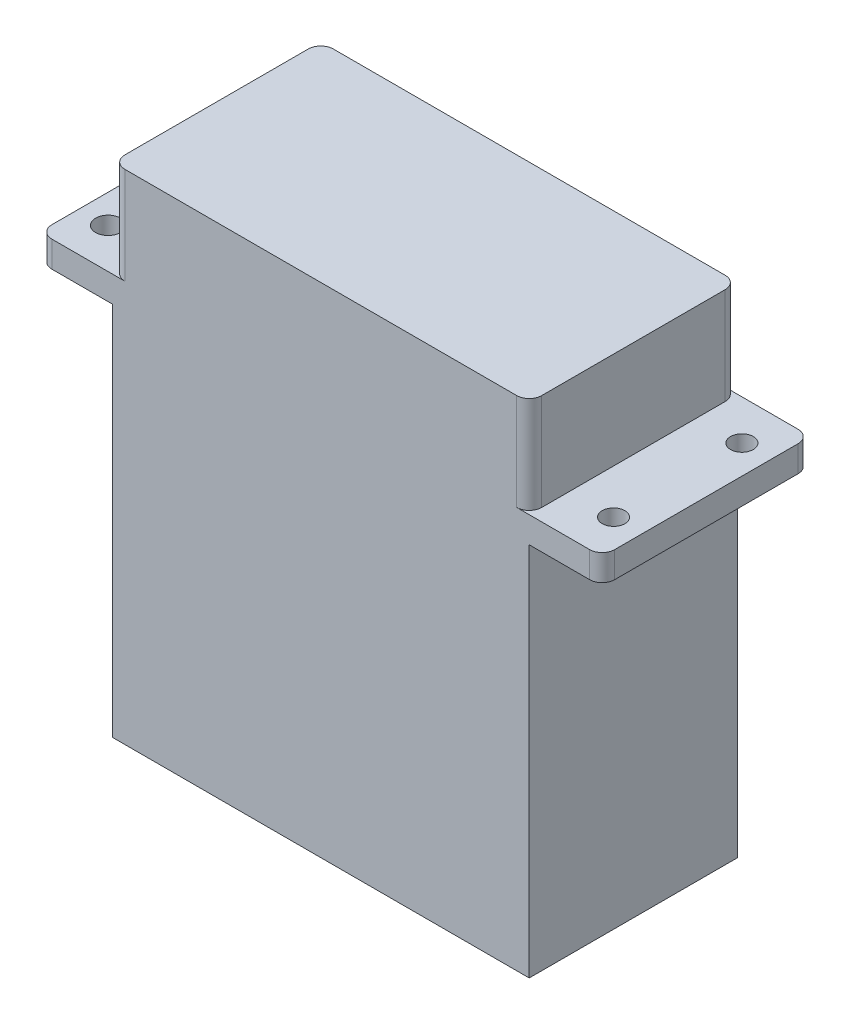
ISO-10303-21;
HEADER;
FILE_DESCRIPTION(('STEP AP214'),'2;1');
FILE_NAME('part.step','',(''),(''),'','','');
FILE_SCHEMA(('AUTOMOTIVE_DESIGN { 1 0 10303 214 1 1 1 1 }'));
ENDSEC;
DATA;
#1=APPLICATION_CONTEXT('core data for automotive mechanical design processes');
#2=APPLICATION_PROTOCOL_DEFINITION('international standard','automotive_design',2000,#1);
#3=PRODUCT_CONTEXT('',#1,'mechanical');
#4=PRODUCT('Part','Part','',(#3));
#5=PRODUCT_RELATED_PRODUCT_CATEGORY('part','',(#4));
#6=PRODUCT_DEFINITION_FORMATION('','',#4);
#7=PRODUCT_DEFINITION_CONTEXT('part definition',#1,'design');
#8=PRODUCT_DEFINITION('design','',#6,#7);
#9=PRODUCT_DEFINITION_SHAPE('','',#8);
#10=(LENGTH_UNIT() NAMED_UNIT(*) SI_UNIT(.MILLI.,.METRE.));
#11=(NAMED_UNIT(*) PLANE_ANGLE_UNIT() SI_UNIT($,.RADIAN.));
#12=(NAMED_UNIT(*) SI_UNIT($,.STERADIAN.) SOLID_ANGLE_UNIT());
#13=UNCERTAINTY_MEASURE_WITH_UNIT(LENGTH_MEASURE(1.E-05),#10,'distance_accuracy_value','');
#14=(GEOMETRIC_REPRESENTATION_CONTEXT(3) GLOBAL_UNCERTAINTY_ASSIGNED_CONTEXT((#13)) GLOBAL_UNIT_ASSIGNED_CONTEXT((#10,
#11,#12)) REPRESENTATION_CONTEXT('',''));
#15=CARTESIAN_POINT('',(0.,0.,0.));
#16=DIRECTION('',(0.,0.,1.));
#17=DIRECTION('',(1.,0.,0.));
#18=AXIS2_PLACEMENT_3D('',#15,#16,#17);
#19=CARTESIAN_POINT('',(52.8,0.,-1.2));
#20=DIRECTION('',(0.,1.,0.));
#21=DIRECTION('',(0.,0.,1.));
#22=AXIS2_PLACEMENT_3D('',#19,#20,#21);
#23=PLANE('',#22);
#24=CARTESIAN_POINT('',(2.75,0.,-3.84098530833331));
#25=DIRECTION('',(0.,1.,0.));
#26=DIRECTION('',(0.,0.,-1.));
#27=AXIS2_PLACEMENT_3D('',#24,#25,#26);
#28=CIRCLE('',#27,1.20002723055091);
#29=CARTESIAN_POINT('',(2.75,0.,-5.04101253888422));
#30=VERTEX_POINT('',#29);
#31=EDGE_CURVE('E263',#30,#30,#28,.T.);
#32=ORIENTED_EDGE('',*,*,#31,.T.);
#33=EDGE_LOOP('',(#32));
#34=FACE_BOUND('',#33,.T.);
#35=CARTESIAN_POINT('',(2.75,0.,-16.1590146916667));
#36=DIRECTION('',(0.,1.,0.));
#37=DIRECTION('',(0.,0.,1.));
#38=AXIS2_PLACEMENT_3D('',#35,#36,#37);
#39=CIRCLE('',#38,1.20002723055091);
#40=CARTESIAN_POINT('',(2.75,0.,-14.9589874611158));
#41=VERTEX_POINT('',#40);
#42=EDGE_CURVE('E279',#41,#41,#39,.T.);
#43=ORIENTED_EDGE('',*,*,#42,.T.);
#44=EDGE_LOOP('',(#43));
#45=FACE_BOUND('',#44,.T.);
#46=DIRECTION('',(0.,0.,-1.));
#47=VECTOR('',#46,1.);
#48=CARTESIAN_POINT('',(7.,0.,0.));
#49=LINE('',#48,#47);
#50=CARTESIAN_POINT('',(7.,0.,0.));
#51=VERTEX_POINT('',#50);
#52=CARTESIAN_POINT('',(7.,0.,-20.));
#53=VERTEX_POINT('',#52);
#54=EDGE_CURVE('E198',#51,#53,#49,.T.);
#55=ORIENTED_EDGE('',*,*,#54,.F.);
#56=DIRECTION('',(1.,0.,0.));
#57=VECTOR('',#56,1.);
#58=CARTESIAN_POINT('',(1.20000000000001,0.,0.));
#59=LINE('',#58,#57);
#60=CARTESIAN_POINT('',(1.20000000000001,0.,0.));
#61=VERTEX_POINT('',#60);
#62=EDGE_CURVE('E292',#61,#51,#59,.T.);
#63=ORIENTED_EDGE('',*,*,#62,.F.);
#64=CARTESIAN_POINT('',(1.2,0.,-1.2));
#65=DIRECTION('',(0.,1.,0.));
#66=DIRECTION('',(0.,0.,-1.));
#67=AXIS2_PLACEMENT_3D('',#64,#65,#66);
#68=CIRCLE('',#67,1.2);
#69=CARTESIAN_POINT('',(0.,0.,-1.20000000000001));
#70=VERTEX_POINT('',#69);
#71=EDGE_CURVE('E321',#70,#61,#68,.T.);
#72=ORIENTED_EDGE('',*,*,#71,.F.);
#73=DIRECTION('',(0.,0.,1.));
#74=VECTOR('',#73,1.);
#75=CARTESIAN_POINT('',(0.,0.,-1.20000000000001));
#76=LINE('',#75,#74);
#77=CARTESIAN_POINT('',(0.,0.,-18.8));
#78=VERTEX_POINT('',#77);
#79=EDGE_CURVE('E319',#78,#70,#76,.T.);
#80=ORIENTED_EDGE('',*,*,#79,.F.);
#81=CARTESIAN_POINT('',(1.2,0.,-18.8));
#82=DIRECTION('',(0.,1.,0.));
#83=DIRECTION('',(0.,0.,-1.));
#84=AXIS2_PLACEMENT_3D('',#81,#82,#83);
#85=CIRCLE('',#84,1.2);
#86=CARTESIAN_POINT('',(1.2,0.,-20.));
#87=VERTEX_POINT('',#86);
#88=EDGE_CURVE('E317',#87,#78,#85,.T.);
#89=ORIENTED_EDGE('',*,*,#88,.F.);
#90=DIRECTION('',(-1.,0.,0.));
#91=VECTOR('',#90,1.);
#92=CARTESIAN_POINT('',(1.20000000000001,0.,-20.));
#93=LINE('',#92,#91);
#94=EDGE_CURVE('E54',#53,#87,#93,.T.);
#95=ORIENTED_EDGE('',*,*,#94,.F.);
#96=EDGE_LOOP('',(#55,#63,#72,#80,#89,#95));
#97=FACE_BOUND('',#96,.T.);
#98=ADVANCED_FACE('F39',(#34,#45,#97),#23,.F.);
#99=CARTESIAN_POINT('',(51.25,0.,-3.84098530833331));
#100=DIRECTION('',(0.,1.,0.));
#101=DIRECTION('',(0.,0.,-1.));
#102=AXIS2_PLACEMENT_3D('',#99,#100,#101);
#103=CIRCLE('',#102,1.08768401807164);
#104=CARTESIAN_POINT('',(51.25,0.,-4.92866932640495));
#105=VERTEX_POINT('',#104);
#106=EDGE_CURVE('E267',#105,#105,#103,.T.);
#107=ORIENTED_EDGE('',*,*,#106,.T.);
#108=EDGE_LOOP('',(#107));
#109=FACE_BOUND('',#108,.T.);
#110=CARTESIAN_POINT('',(51.25,0.,-16.1590146916667));
#111=DIRECTION('',(0.,1.,0.));
#112=DIRECTION('',(0.,0.,1.));
#113=AXIS2_PLACEMENT_3D('',#110,#111,#112);
#114=CIRCLE('',#113,1.08768401807164);
#115=CARTESIAN_POINT('',(51.25,0.,-15.071330673595));
#116=VERTEX_POINT('',#115);
#117=EDGE_CURVE('E273',#116,#116,#114,.T.);
#118=ORIENTED_EDGE('',*,*,#117,.T.);
#119=EDGE_LOOP('',(#118));
#120=FACE_BOUND('',#119,.T.);
#121=DIRECTION('',(0.,0.,1.));
#122=VECTOR('',#121,1.);
#123=CARTESIAN_POINT('',(47.,0.,0.));
#124=LINE('',#123,#122);
#125=CARTESIAN_POINT('',(47.,0.,-20.));
#126=VERTEX_POINT('',#125);
#127=CARTESIAN_POINT('',(47.,0.,0.));
#128=VERTEX_POINT('',#127);
#129=EDGE_CURVE('E62',#126,#128,#124,.T.);
#130=ORIENTED_EDGE('',*,*,#129,.F.);
#131=CARTESIAN_POINT('',(52.8,0.,-20.));
#132=VERTEX_POINT('',#131);
#133=EDGE_CURVE('E315',#132,#126,#93,.T.);
#134=ORIENTED_EDGE('',*,*,#133,.F.);
#135=CARTESIAN_POINT('',(52.8,0.,-18.8));
#136=DIRECTION('',(0.,1.,0.));
#137=DIRECTION('',(0.,0.,-1.));
#138=AXIS2_PLACEMENT_3D('',#135,#136,#137);
#139=CIRCLE('',#138,1.2);
#140=CARTESIAN_POINT('',(54.,0.,-18.8));
#141=VERTEX_POINT('',#140);
#142=EDGE_CURVE('E313',#141,#132,#139,.T.);
#143=ORIENTED_EDGE('',*,*,#142,.F.);
#144=DIRECTION('',(0.,0.,-1.));
#145=VECTOR('',#144,1.);
#146=CARTESIAN_POINT('',(54.,0.,-1.20000000000001));
#147=LINE('',#146,#145);
#148=CARTESIAN_POINT('',(54.,0.,-1.20000000000001));
#149=VERTEX_POINT('',#148);
#150=EDGE_CURVE('E311',#149,#141,#147,.T.);
#151=ORIENTED_EDGE('',*,*,#150,.F.);
#152=CARTESIAN_POINT('',(52.8,0.,-1.2));
#153=DIRECTION('',(0.,1.,0.));
#154=DIRECTION('',(0.,0.,1.));
#155=AXIS2_PLACEMENT_3D('',#152,#153,#154);
#156=CIRCLE('',#155,1.2);
#157=CARTESIAN_POINT('',(52.8,0.,0.));
#158=VERTEX_POINT('',#157);
#159=EDGE_CURVE('E285',#158,#149,#156,.T.);
#160=ORIENTED_EDGE('',*,*,#159,.F.);
#161=EDGE_CURVE('E323',#128,#158,#59,.T.);
#162=ORIENTED_EDGE('',*,*,#161,.F.);
#163=EDGE_LOOP('',(#130,#134,#143,#151,#160,#162));
#164=FACE_BOUND('',#163,.T.);
#165=ADVANCED_FACE('F350',(#109,#120,#164),#23,.F.);
#166=CARTESIAN_POINT('',(52.8,2.5,-1.2));
#167=DIRECTION('',(0.,1.,0.));
#168=DIRECTION('',(0.,0.,1.));
#169=AXIS2_PLACEMENT_3D('',#166,#167,#168);
#170=PLANE('',#169);
#171=CARTESIAN_POINT('',(45.8,2.5,-18.8));
#172=DIRECTION('',(0.,1.,0.));
#173=DIRECTION('',(0.,0.,-1.));
#174=AXIS2_PLACEMENT_3D('',#171,#172,#173);
#175=CIRCLE('',#174,1.2);
#176=CARTESIAN_POINT('',(47.,2.5,-18.8));
#177=VERTEX_POINT('',#176);
#178=CARTESIAN_POINT('',(45.8,2.5,-20.));
#179=VERTEX_POINT('',#178);
#180=EDGE_CURVE('E212',#177,#179,#175,.T.);
#181=ORIENTED_EDGE('',*,*,#180,.F.);
#182=DIRECTION('',(0.,0.,-1.));
#183=VECTOR('',#182,1.);
#184=CARTESIAN_POINT('',(47.,2.5,-18.8));
#185=LINE('',#184,#183);
#186=CARTESIAN_POINT('',(47.,2.5,-1.20000000000001));
#187=VERTEX_POINT('',#186);
#188=EDGE_CURVE('E235',#187,#177,#185,.T.);
#189=ORIENTED_EDGE('',*,*,#188,.F.);
#190=CARTESIAN_POINT('',(45.8,2.5,-1.2));
#191=DIRECTION('',(0.,1.,0.));
#192=DIRECTION('',(0.,0.,1.));
#193=AXIS2_PLACEMENT_3D('',#190,#191,#192);
#194=CIRCLE('',#193,1.2);
#195=CARTESIAN_POINT('',(45.8,2.5,0.));
#196=VERTEX_POINT('',#195);
#197=EDGE_CURVE('E232',#196,#187,#194,.T.);
#198=ORIENTED_EDGE('',*,*,#197,.F.);
#199=DIRECTION('',(1.,0.,0.));
#200=VECTOR('',#199,1.);
#201=CARTESIAN_POINT('',(1.20000000000001,2.5,0.));
#202=LINE('',#201,#200);
#203=CARTESIAN_POINT('',(52.8,2.5,0.));
#204=VERTEX_POINT('',#203);
#205=EDGE_CURVE('E305',#196,#204,#202,.T.);
#206=ORIENTED_EDGE('',*,*,#205,.T.);
#207=CARTESIAN_POINT('',(52.8,2.5,-1.2));
#208=DIRECTION('',(0.,1.,0.));
#209=DIRECTION('',(0.,0.,1.));
#210=AXIS2_PLACEMENT_3D('',#207,#208,#209);
#211=CIRCLE('',#210,1.2);
#212=CARTESIAN_POINT('',(54.,2.5,-1.20000000000001));
#213=VERTEX_POINT('',#212);
#214=EDGE_CURVE('E288',#204,#213,#211,.T.);
#215=ORIENTED_EDGE('',*,*,#214,.T.);
#216=DIRECTION('',(0.,0.,-1.));
#217=VECTOR('',#216,1.);
#218=CARTESIAN_POINT('',(54.,2.5,-1.20000000000001));
#219=LINE('',#218,#217);
#220=CARTESIAN_POINT('',(54.,2.5,-18.8));
#221=VERTEX_POINT('',#220);
#222=EDGE_CURVE('E291',#213,#221,#219,.T.);
#223=ORIENTED_EDGE('',*,*,#222,.T.);
#224=CARTESIAN_POINT('',(52.8,2.5,-18.8));
#225=DIRECTION('',(0.,1.,0.));
#226=DIRECTION('',(0.,0.,-1.));
#227=AXIS2_PLACEMENT_3D('',#224,#225,#226);
#228=CIRCLE('',#227,1.2);
#229=CARTESIAN_POINT('',(52.8,2.5,-20.));
#230=VERTEX_POINT('',#229);
#231=EDGE_CURVE('E294',#221,#230,#228,.T.);
#232=ORIENTED_EDGE('',*,*,#231,.T.);
#233=DIRECTION('',(-1.,0.,0.));
#234=VECTOR('',#233,1.);
#235=CARTESIAN_POINT('',(1.20000000000001,2.5,-20.));
#236=LINE('',#235,#234);
#237=EDGE_CURVE('E297',#230,#179,#236,.T.);
#238=ORIENTED_EDGE('',*,*,#237,.T.);
#239=EDGE_LOOP('',(#181,#189,#198,#206,#215,#223,#232,#238));
#240=FACE_BOUND('',#239,.T.);
#241=CARTESIAN_POINT('',(51.25,2.5,-16.1590146916667));
#242=DIRECTION('',(0.,1.,0.));
#243=DIRECTION('',(0.,0.,1.));
#244=AXIS2_PLACEMENT_3D('',#241,#242,#243);
#245=CIRCLE('',#244,1.08768401807164);
#246=CARTESIAN_POINT('',(51.25,2.5,-15.071330673595));
#247=VERTEX_POINT('',#246);
#248=EDGE_CURVE('E276',#247,#247,#245,.T.);
#249=ORIENTED_EDGE('',*,*,#248,.F.);
#250=EDGE_LOOP('',(#249));
#251=FACE_BOUND('',#250,.T.);
#252=CARTESIAN_POINT('',(51.25,2.5,-3.84098530833331));
#253=DIRECTION('',(0.,1.,0.));
#254=DIRECTION('',(0.,0.,-1.));
#255=AXIS2_PLACEMENT_3D('',#252,#253,#254);
#256=CIRCLE('',#255,1.08768401807164);
#257=CARTESIAN_POINT('',(51.25,2.5,-4.92866932640495));
#258=VERTEX_POINT('',#257);
#259=EDGE_CURVE('E270',#258,#258,#256,.T.);
#260=ORIENTED_EDGE('',*,*,#259,.F.);
#261=EDGE_LOOP('',(#260));
#262=FACE_BOUND('',#261,.T.);
#263=ADVANCED_FACE('F400',(#240,#251,#262),#170,.T.);
#264=CARTESIAN_POINT('',(8.2,2.5,-18.8));
#265=DIRECTION('',(0.,1.,0.));
#266=DIRECTION('',(0.,0.,1.));
#267=AXIS2_PLACEMENT_3D('',#264,#265,#266);
#268=CIRCLE('',#267,1.2);
#269=CARTESIAN_POINT('',(8.2,2.5,-20.));
#270=VERTEX_POINT('',#269);
#271=CARTESIAN_POINT('',(7.,2.5,-18.8));
#272=VERTEX_POINT('',#271);
#273=EDGE_CURVE('E199',#270,#272,#268,.T.);
#274=ORIENTED_EDGE('',*,*,#273,.F.);
#275=CARTESIAN_POINT('',(1.2,2.5,-20.));
#276=VERTEX_POINT('',#275);
#277=EDGE_CURVE('E296',#270,#276,#236,.T.);
#278=ORIENTED_EDGE('',*,*,#277,.T.);
#279=CARTESIAN_POINT('',(1.2,2.5,-18.8));
#280=DIRECTION('',(0.,1.,0.));
#281=DIRECTION('',(0.,0.,-1.));
#282=AXIS2_PLACEMENT_3D('',#279,#280,#281);
#283=CIRCLE('',#282,1.2);
#284=CARTESIAN_POINT('',(0.,2.5,-18.8));
#285=VERTEX_POINT('',#284);
#286=EDGE_CURVE('E299',#276,#285,#283,.T.);
#287=ORIENTED_EDGE('',*,*,#286,.T.);
#288=DIRECTION('',(0.,0.,1.));
#289=VECTOR('',#288,1.);
#290=CARTESIAN_POINT('',(0.,2.5,-1.20000000000001));
#291=LINE('',#290,#289);
#292=CARTESIAN_POINT('',(0.,2.5,-1.20000000000001));
#293=VERTEX_POINT('',#292);
#294=EDGE_CURVE('E301',#285,#293,#291,.T.);
#295=ORIENTED_EDGE('',*,*,#294,.T.);
#296=CARTESIAN_POINT('',(1.2,2.5,-1.2));
#297=DIRECTION('',(0.,1.,0.));
#298=DIRECTION('',(0.,0.,-1.));
#299=AXIS2_PLACEMENT_3D('',#296,#297,#298);
#300=CIRCLE('',#299,1.2);
#301=CARTESIAN_POINT('',(1.20000000000001,2.5,0.));
#302=VERTEX_POINT('',#301);
#303=EDGE_CURVE('E303',#293,#302,#300,.T.);
#304=ORIENTED_EDGE('',*,*,#303,.T.);
#305=CARTESIAN_POINT('',(8.2,2.5,0.));
#306=VERTEX_POINT('',#305);
#307=EDGE_CURVE('E306',#302,#306,#202,.T.);
#308=ORIENTED_EDGE('',*,*,#307,.T.);
#309=CARTESIAN_POINT('',(8.2,2.5,-1.2));
#310=DIRECTION('',(0.,1.,0.));
#311=DIRECTION('',(0.,0.,1.));
#312=AXIS2_PLACEMENT_3D('',#309,#310,#311);
#313=CIRCLE('',#312,1.2);
#314=CARTESIAN_POINT('',(7.,2.5,-1.20000000000001));
#315=VERTEX_POINT('',#314);
#316=EDGE_CURVE('E229',#315,#306,#313,.T.);
#317=ORIENTED_EDGE('',*,*,#316,.F.);
#318=DIRECTION('',(0.,0.,1.));
#319=VECTOR('',#318,1.);
#320=CARTESIAN_POINT('',(7.,2.5,-18.8));
#321=LINE('',#320,#319);
#322=EDGE_CURVE('E202',#272,#315,#321,.T.);
#323=ORIENTED_EDGE('',*,*,#322,.F.);
#324=EDGE_LOOP('',(#274,#278,#287,#295,#304,#308,#317,#323));
#325=FACE_BOUND('',#324,.T.);
#326=CARTESIAN_POINT('',(2.75,2.5,-16.1590146916667));
#327=DIRECTION('',(0.,1.,0.));
#328=DIRECTION('',(0.,0.,1.));
#329=AXIS2_PLACEMENT_3D('',#326,#327,#328);
#330=CIRCLE('',#329,1.20002723055091);
#331=CARTESIAN_POINT('',(2.75,2.5,-14.9589874611158));
#332=VERTEX_POINT('',#331);
#333=EDGE_CURVE('E282',#332,#332,#330,.T.);
#334=ORIENTED_EDGE('',*,*,#333,.F.);
#335=EDGE_LOOP('',(#334));
#336=FACE_BOUND('',#335,.T.);
#337=CARTESIAN_POINT('',(2.75,2.5,-3.84098530833331));
#338=DIRECTION('',(0.,1.,0.));
#339=DIRECTION('',(0.,0.,-1.));
#340=AXIS2_PLACEMENT_3D('',#337,#338,#339);
#341=CIRCLE('',#340,1.20002723055091);
#342=CARTESIAN_POINT('',(2.75,2.5,-5.04101253888422));
#343=VERTEX_POINT('',#342);
#344=EDGE_CURVE('E264',#343,#343,#341,.T.);
#345=ORIENTED_EDGE('',*,*,#344,.F.);
#346=EDGE_LOOP('',(#345));
#347=FACE_BOUND('',#346,.T.);
#348=ADVANCED_FACE('F422',(#325,#336,#347),#170,.T.);
#349=CARTESIAN_POINT('',(52.8,2.5,-1.2));
#350=DIRECTION('',(0.,-1.,0.));
#351=DIRECTION('',(0.,0.,-1.));
#352=AXIS2_PLACEMENT_3D('',#349,#350,#351);
#353=CYLINDRICAL_SURFACE('',#352,1.2);
#354=ORIENTED_EDGE('',*,*,#159,.T.);
#355=DIRECTION('',(0.,-1.,0.));
#356=VECTOR('',#355,1.);
#357=CARTESIAN_POINT('',(54.,2.5,-1.20000000000001));
#358=LINE('',#357,#356);
#359=EDGE_CURVE('E11',#213,#149,#358,.T.);
#360=ORIENTED_EDGE('',*,*,#359,.F.);
#361=ORIENTED_EDGE('',*,*,#214,.F.);
#362=DIRECTION('',(0.,-1.,0.));
#363=VECTOR('',#362,1.);
#364=CARTESIAN_POINT('',(52.8,2.5,0.));
#365=LINE('',#364,#363);
#366=EDGE_CURVE('E308',#204,#158,#365,.T.);
#367=ORIENTED_EDGE('',*,*,#366,.T.);
#368=EDGE_LOOP('',(#354,#360,#361,#367));
#369=FACE_BOUND('',#368,.T.);
#370=ADVANCED_FACE('F41',(#369),#353,.T.);
#371=CARTESIAN_POINT('',(54.,2.5,-1.20000000000001));
#372=DIRECTION('',(-1.,0.,0.));
#373=DIRECTION('',(0.,0.,1.));
#374=AXIS2_PLACEMENT_3D('',#371,#372,#373);
#375=PLANE('',#374);
#376=ORIENTED_EDGE('',*,*,#150,.T.);
#377=DIRECTION('',(0.,-1.,0.));
#378=VECTOR('',#377,1.);
#379=CARTESIAN_POINT('',(54.,2.5,-18.8));
#380=LINE('',#379,#378);
#381=EDGE_CURVE('E47',#221,#141,#380,.T.);
#382=ORIENTED_EDGE('',*,*,#381,.F.);
#383=ORIENTED_EDGE('',*,*,#222,.F.);
#384=ORIENTED_EDGE('',*,*,#359,.T.);
#385=EDGE_LOOP('',(#376,#382,#383,#384));
#386=FACE_BOUND('',#385,.T.);
#387=ADVANCED_FACE('F415',(#386),#375,.F.);
#388=CARTESIAN_POINT('',(52.8,2.5,-18.8));
#389=DIRECTION('',(0.,-1.,0.));
#390=DIRECTION('',(0.,0.,-1.));
#391=AXIS2_PLACEMENT_3D('',#388,#389,#390);
#392=CYLINDRICAL_SURFACE('',#391,1.2);
#393=ORIENTED_EDGE('',*,*,#142,.T.);
#394=DIRECTION('',(0.,-1.,0.));
#395=VECTOR('',#394,1.);
#396=CARTESIAN_POINT('',(52.8,2.5,-20.));
#397=LINE('',#396,#395);
#398=EDGE_CURVE('E340',#230,#132,#397,.T.);
#399=ORIENTED_EDGE('',*,*,#398,.F.);
#400=ORIENTED_EDGE('',*,*,#231,.F.);
#401=ORIENTED_EDGE('',*,*,#381,.T.);
#402=EDGE_LOOP('',(#393,#399,#400,#401));
#403=FACE_BOUND('',#402,.T.);
#404=ADVANCED_FACE('F347',(#403),#392,.T.);
#405=CARTESIAN_POINT('',(1.20000000000001,2.5,-20.));
#406=DIRECTION('',(0.,0.,1.));
#407=DIRECTION('',(1.,0.,0.));
#408=AXIS2_PLACEMENT_3D('',#405,#406,#407);
#409=PLANE('',#408);
#410=ORIENTED_EDGE('',*,*,#133,.T.);
#411=DIRECTION('',(0.,1.,0.));
#412=VECTOR('',#411,1.);
#413=CARTESIAN_POINT('',(47.,-36.,-20.));
#414=LINE('',#413,#412);
#415=CARTESIAN_POINT('',(47.,-36.,-20.));
#416=VERTEX_POINT('',#415);
#417=EDGE_CURVE('E183',#416,#126,#414,.T.);
#418=ORIENTED_EDGE('',*,*,#417,.F.);
#419=DIRECTION('',(1.,0.,0.));
#420=VECTOR('',#419,1.);
#421=CARTESIAN_POINT('',(7.,-36.,-20.));
#422=LINE('',#421,#420);
#423=CARTESIAN_POINT('',(7.,-36.,-20.));
#424=VERTEX_POINT('',#423);
#425=EDGE_CURVE('E176',#424,#416,#422,.T.);
#426=ORIENTED_EDGE('',*,*,#425,.F.);
#427=DIRECTION('',(0.,1.,0.));
#428=VECTOR('',#427,1.);
#429=CARTESIAN_POINT('',(7.,-36.,-20.));
#430=LINE('',#429,#428);
#431=EDGE_CURVE('E180',#424,#53,#430,.T.);
#432=ORIENTED_EDGE('',*,*,#431,.T.);
#433=ORIENTED_EDGE('',*,*,#94,.T.);
#434=DIRECTION('',(0.,-1.,0.));
#435=VECTOR('',#434,1.);
#436=CARTESIAN_POINT('',(1.2,2.5,-20.));
#437=LINE('',#436,#435);
#438=EDGE_CURVE('E337',#276,#87,#437,.T.);
#439=ORIENTED_EDGE('',*,*,#438,.F.);
#440=ORIENTED_EDGE('',*,*,#277,.F.);
#441=DIRECTION('',(0.,-1.,0.));
#442=VECTOR('',#441,1.);
#443=CARTESIAN_POINT('',(8.20000000000001,11.8,-20.));
#444=LINE('',#443,#442);
#445=CARTESIAN_POINT('',(8.20000000000001,11.8,-20.));
#446=VERTEX_POINT('',#445);
#447=EDGE_CURVE('E225',#446,#270,#444,.T.);
#448=ORIENTED_EDGE('',*,*,#447,.F.);
#449=DIRECTION('',(-1.,0.,0.));
#450=VECTOR('',#449,1.);
#451=CARTESIAN_POINT('',(8.20000000000001,11.8,-20.));
#452=LINE('',#451,#450);
#453=CARTESIAN_POINT('',(45.8,11.8,-20.));
#454=VERTEX_POINT('',#453);
#455=EDGE_CURVE('E224',#454,#446,#452,.T.);
#456=ORIENTED_EDGE('',*,*,#455,.F.);
#457=DIRECTION('',(0.,-1.,0.));
#458=VECTOR('',#457,1.);
#459=CARTESIAN_POINT('',(45.8,11.8,-20.));
#460=LINE('',#459,#458);
#461=EDGE_CURVE('E242',#454,#179,#460,.T.);
#462=ORIENTED_EDGE('',*,*,#461,.T.);
#463=ORIENTED_EDGE('',*,*,#237,.F.);
#464=ORIENTED_EDGE('',*,*,#398,.T.);
#465=EDGE_LOOP('',(#410,#418,#426,#432,#433,#439,#440,#448,#456,#462,#463,#464));
#466=FACE_BOUND('',#465,.T.);
#467=ADVANCED_FACE('F178',(#466),#409,.F.);
#468=CARTESIAN_POINT('',(1.2,2.5,-18.8));
#469=DIRECTION('',(0.,-1.,0.));
#470=DIRECTION('',(0.,0.,-1.));
#471=AXIS2_PLACEMENT_3D('',#468,#469,#470);
#472=CYLINDRICAL_SURFACE('',#471,1.2);
#473=ORIENTED_EDGE('',*,*,#88,.T.);
#474=DIRECTION('',(0.,-1.,0.));
#475=VECTOR('',#474,1.);
#476=CARTESIAN_POINT('',(0.,2.5,-18.8));
#477=LINE('',#476,#475);
#478=EDGE_CURVE('E334',#285,#78,#477,.T.);
#479=ORIENTED_EDGE('',*,*,#478,.F.);
#480=ORIENTED_EDGE('',*,*,#286,.F.);
#481=ORIENTED_EDGE('',*,*,#438,.T.);
#482=EDGE_LOOP('',(#473,#479,#480,#481));
#483=FACE_BOUND('',#482,.T.);
#484=ADVANCED_FACE('F381',(#483),#472,.T.);
#485=CARTESIAN_POINT('',(0.,2.5,-1.20000000000001));
#486=DIRECTION('',(1.,0.,0.));
#487=DIRECTION('',(0.,0.,-1.));
#488=AXIS2_PLACEMENT_3D('',#485,#486,#487);
#489=PLANE('',#488);
#490=ORIENTED_EDGE('',*,*,#79,.T.);
#491=DIRECTION('',(0.,-1.,0.));
#492=VECTOR('',#491,1.);
#493=CARTESIAN_POINT('',(0.,2.5,-1.20000000000001));
#494=LINE('',#493,#492);
#495=EDGE_CURVE('E331',#293,#70,#494,.T.);
#496=ORIENTED_EDGE('',*,*,#495,.F.);
#497=ORIENTED_EDGE('',*,*,#294,.F.);
#498=ORIENTED_EDGE('',*,*,#478,.T.);
#499=EDGE_LOOP('',(#490,#496,#497,#498));
#500=FACE_BOUND('',#499,.T.);
#501=ADVANCED_FACE('F377',(#500),#489,.F.);
#502=CARTESIAN_POINT('',(1.2,2.5,-1.2));
#503=DIRECTION('',(0.,-1.,0.));
#504=DIRECTION('',(0.,0.,-1.));
#505=AXIS2_PLACEMENT_3D('',#502,#503,#504);
#506=CYLINDRICAL_SURFACE('',#505,1.2);
#507=ORIENTED_EDGE('',*,*,#71,.T.);
#508=DIRECTION('',(0.,-1.,0.));
#509=VECTOR('',#508,1.);
#510=CARTESIAN_POINT('',(1.20000000000001,2.5,0.));
#511=LINE('',#510,#509);
#512=EDGE_CURVE('E328',#302,#61,#511,.T.);
#513=ORIENTED_EDGE('',*,*,#512,.F.);
#514=ORIENTED_EDGE('',*,*,#303,.F.);
#515=ORIENTED_EDGE('',*,*,#495,.T.);
#516=EDGE_LOOP('',(#507,#513,#514,#515));
#517=FACE_BOUND('',#516,.T.);
#518=ADVANCED_FACE('F372',(#517),#506,.T.);
#519=CARTESIAN_POINT('',(1.20000000000001,2.5,0.));
#520=DIRECTION('',(0.,0.,-1.));
#521=DIRECTION('',(-1.,0.,0.));
#522=AXIS2_PLACEMENT_3D('',#519,#520,#521);
#523=PLANE('',#522);
#524=ORIENTED_EDGE('',*,*,#62,.T.);
#525=DIRECTION('',(0.,1.,0.));
#526=VECTOR('',#525,1.);
#527=CARTESIAN_POINT('',(7.,-36.,0.));
#528=LINE('',#527,#526);
#529=CARTESIAN_POINT('',(7.,-36.,0.));
#530=VERTEX_POINT('',#529);
#531=EDGE_CURVE('E358',#530,#51,#528,.T.);
#532=ORIENTED_EDGE('',*,*,#531,.F.);
#533=DIRECTION('',(-1.,0.,0.));
#534=VECTOR('',#533,1.);
#535=CARTESIAN_POINT('',(7.,-36.,0.));
#536=LINE('',#535,#534);
#537=CARTESIAN_POINT('',(47.,-36.,0.));
#538=VERTEX_POINT('',#537);
#539=EDGE_CURVE('E192',#538,#530,#536,.T.);
#540=ORIENTED_EDGE('',*,*,#539,.F.);
#541=DIRECTION('',(0.,1.,0.));
#542=VECTOR('',#541,1.);
#543=CARTESIAN_POINT('',(47.,-36.,0.));
#544=LINE('',#543,#542);
#545=EDGE_CURVE('E204',#538,#128,#544,.T.);
#546=ORIENTED_EDGE('',*,*,#545,.T.);
#547=ORIENTED_EDGE('',*,*,#161,.T.);
#548=ORIENTED_EDGE('',*,*,#366,.F.);
#549=ORIENTED_EDGE('',*,*,#205,.F.);
#550=DIRECTION('',(0.,-1.,0.));
#551=VECTOR('',#550,1.);
#552=CARTESIAN_POINT('',(45.8,11.8,0.));
#553=LINE('',#552,#551);
#554=CARTESIAN_POINT('',(45.8,11.8,0.));
#555=VERTEX_POINT('',#554);
#556=EDGE_CURVE('E251',#555,#196,#553,.T.);
#557=ORIENTED_EDGE('',*,*,#556,.F.);
#558=DIRECTION('',(1.,0.,0.));
#559=VECTOR('',#558,1.);
#560=CARTESIAN_POINT('',(8.20000000000001,11.8,0.));
#561=LINE('',#560,#559);
#562=CARTESIAN_POINT('',(8.20000000000001,11.8,0.));
#563=VERTEX_POINT('',#562);
#564=EDGE_CURVE('E216',#563,#555,#561,.T.);
#565=ORIENTED_EDGE('',*,*,#564,.F.);
#566=DIRECTION('',(0.,-1.,0.));
#567=VECTOR('',#566,1.);
#568=CARTESIAN_POINT('',(8.20000000000001,11.8,0.));
#569=LINE('',#568,#567);
#570=EDGE_CURVE('E254',#563,#306,#569,.T.);
#571=ORIENTED_EDGE('',*,*,#570,.T.);
#572=ORIENTED_EDGE('',*,*,#307,.F.);
#573=ORIENTED_EDGE('',*,*,#512,.T.);
#574=EDGE_LOOP('',(#524,#532,#540,#546,#547,#548,#549,#557,#565,#571,#572,#573));
#575=FACE_BOUND('',#574,.T.);
#576=ADVANCED_FACE('F364',(#575),#523,.F.);
#577=CARTESIAN_POINT('',(2.75,2.5,-16.1590146916667));
#578=DIRECTION('',(0.,-1.,0.));
#579=DIRECTION('',(0.,0.,-1.));
#580=AXIS2_PLACEMENT_3D('',#577,#578,#579);
#581=CYLINDRICAL_SURFACE('',#580,1.20002723055091);
#582=ORIENTED_EDGE('',*,*,#333,.T.);
#583=EDGE_LOOP('',(#582));
#584=FACE_BOUND('',#583,.T.);
#585=ORIENTED_EDGE('',*,*,#42,.F.);
#586=EDGE_LOOP('',(#585));
#587=FACE_BOUND('',#586,.T.);
#588=ADVANCED_FACE('F436',(#584,#587),#581,.F.);
#589=CARTESIAN_POINT('',(51.25,2.5,-16.1590146916667));
#590=DIRECTION('',(0.,-1.,0.));
#591=DIRECTION('',(0.,0.,-1.));
#592=AXIS2_PLACEMENT_3D('',#589,#590,#591);
#593=CYLINDRICAL_SURFACE('',#592,1.08768401807164);
#594=ORIENTED_EDGE('',*,*,#248,.T.);
#595=EDGE_LOOP('',(#594));
#596=FACE_BOUND('',#595,.T.);
#597=ORIENTED_EDGE('',*,*,#117,.F.);
#598=EDGE_LOOP('',(#597));
#599=FACE_BOUND('',#598,.T.);
#600=ADVANCED_FACE('F470',(#596,#599),#593,.F.);
#601=CARTESIAN_POINT('',(51.25,2.5,-3.84098530833331));
#602=DIRECTION('',(0.,-1.,0.));
#603=DIRECTION('',(0.,0.,-1.));
#604=AXIS2_PLACEMENT_3D('',#601,#602,#603);
#605=CYLINDRICAL_SURFACE('',#604,1.08768401807164);
#606=ORIENTED_EDGE('',*,*,#259,.T.);
#607=EDGE_LOOP('',(#606));
#608=FACE_BOUND('',#607,.T.);
#609=ORIENTED_EDGE('',*,*,#106,.F.);
#610=EDGE_LOOP('',(#609));
#611=FACE_BOUND('',#610,.T.);
#612=ADVANCED_FACE('F477',(#608,#611),#605,.F.);
#613=CARTESIAN_POINT('',(2.75,2.5,-3.84098530833331));
#614=DIRECTION('',(0.,-1.,0.));
#615=DIRECTION('',(0.,0.,-1.));
#616=AXIS2_PLACEMENT_3D('',#613,#614,#615);
#617=CYLINDRICAL_SURFACE('',#616,1.20002723055091);
#618=ORIENTED_EDGE('',*,*,#344,.T.);
#619=EDGE_LOOP('',(#618));
#620=FACE_BOUND('',#619,.T.);
#621=ORIENTED_EDGE('',*,*,#31,.F.);
#622=EDGE_LOOP('',(#621));
#623=FACE_BOUND('',#622,.T.);
#624=ADVANCED_FACE('F485',(#620,#623),#617,.F.);
#625=CARTESIAN_POINT('',(8.2,11.8,-18.8));
#626=DIRECTION('',(0.,-1.,0.));
#627=DIRECTION('',(0.,0.,-1.));
#628=AXIS2_PLACEMENT_3D('',#625,#626,#627);
#629=CYLINDRICAL_SURFACE('',#628,1.2);
#630=ORIENTED_EDGE('',*,*,#273,.T.);
#631=DIRECTION('',(0.,-1.,0.));
#632=VECTOR('',#631,1.);
#633=CARTESIAN_POINT('',(7.,11.8,-18.8));
#634=LINE('',#633,#632);
#635=CARTESIAN_POINT('',(7.,11.8,-18.8));
#636=VERTEX_POINT('',#635);
#637=EDGE_CURVE('E260',#636,#272,#634,.T.);
#638=ORIENTED_EDGE('',*,*,#637,.F.);
#639=CARTESIAN_POINT('',(8.2,11.8,-18.8));
#640=DIRECTION('',(0.,1.,0.));
#641=DIRECTION('',(0.,0.,1.));
#642=AXIS2_PLACEMENT_3D('',#639,#640,#641);
#643=CIRCLE('',#642,1.2);
#644=EDGE_CURVE('E208',#446,#636,#643,.T.);
#645=ORIENTED_EDGE('',*,*,#644,.F.);
#646=ORIENTED_EDGE('',*,*,#447,.T.);
#647=EDGE_LOOP('',(#630,#638,#645,#646));
#648=FACE_BOUND('',#647,.T.);
#649=ADVANCED_FACE('F389',(#648),#629,.T.);
#650=CARTESIAN_POINT('',(7.,11.8,-18.8));
#651=DIRECTION('',(1.,0.,0.));
#652=DIRECTION('',(0.,0.,-1.));
#653=AXIS2_PLACEMENT_3D('',#650,#651,#652);
#654=PLANE('',#653);
#655=ORIENTED_EDGE('',*,*,#322,.T.);
#656=DIRECTION('',(0.,-1.,0.));
#657=VECTOR('',#656,1.);
#658=CARTESIAN_POINT('',(7.,11.8,-1.20000000000001));
#659=LINE('',#658,#657);
#660=CARTESIAN_POINT('',(7.,11.8,-1.20000000000001));
#661=VERTEX_POINT('',#660);
#662=EDGE_CURVE('E257',#661,#315,#659,.T.);
#663=ORIENTED_EDGE('',*,*,#662,.F.);
#664=DIRECTION('',(0.,0.,1.));
#665=VECTOR('',#664,1.);
#666=CARTESIAN_POINT('',(7.,11.8,-18.8));
#667=LINE('',#666,#665);
#668=EDGE_CURVE('E211',#636,#661,#667,.T.);
#669=ORIENTED_EDGE('',*,*,#668,.F.);
#670=ORIENTED_EDGE('',*,*,#637,.T.);
#671=EDGE_LOOP('',(#655,#663,#669,#670));
#672=FACE_BOUND('',#671,.T.);
#673=ADVANCED_FACE('F500',(#672),#654,.F.);
#674=CARTESIAN_POINT('',(8.2,11.8,-1.2));
#675=DIRECTION('',(0.,-1.,0.));
#676=DIRECTION('',(0.,0.,-1.));
#677=AXIS2_PLACEMENT_3D('',#674,#675,#676);
#678=CYLINDRICAL_SURFACE('',#677,1.2);
#679=ORIENTED_EDGE('',*,*,#316,.T.);
#680=ORIENTED_EDGE('',*,*,#570,.F.);
#681=CARTESIAN_POINT('',(8.2,11.8,-1.2));
#682=DIRECTION('',(0.,1.,0.));
#683=DIRECTION('',(0.,0.,1.));
#684=AXIS2_PLACEMENT_3D('',#681,#682,#683);
#685=CIRCLE('',#684,1.2);
#686=EDGE_CURVE('E214',#661,#563,#685,.T.);
#687=ORIENTED_EDGE('',*,*,#686,.F.);
#688=ORIENTED_EDGE('',*,*,#662,.T.);
#689=EDGE_LOOP('',(#679,#680,#687,#688));
#690=FACE_BOUND('',#689,.T.);
#691=ADVANCED_FACE('F507',(#690),#678,.T.);
#692=CARTESIAN_POINT('',(45.8,11.8,-1.2));
#693=DIRECTION('',(0.,-1.,0.));
#694=DIRECTION('',(0.,0.,-1.));
#695=AXIS2_PLACEMENT_3D('',#692,#693,#694);
#696=CYLINDRICAL_SURFACE('',#695,1.2);
#697=ORIENTED_EDGE('',*,*,#197,.T.);
#698=DIRECTION('',(0.,-1.,0.));
#699=VECTOR('',#698,1.);
#700=CARTESIAN_POINT('',(47.,11.8,-1.20000000000001));
#701=LINE('',#700,#699);
#702=CARTESIAN_POINT('',(47.,11.8,-1.20000000000001));
#703=VERTEX_POINT('',#702);
#704=EDGE_CURVE('E248',#703,#187,#701,.T.);
#705=ORIENTED_EDGE('',*,*,#704,.F.);
#706=CARTESIAN_POINT('',(45.8,11.8,-1.2));
#707=DIRECTION('',(0.,1.,0.));
#708=DIRECTION('',(0.,0.,1.));
#709=AXIS2_PLACEMENT_3D('',#706,#707,#708);
#710=CIRCLE('',#709,1.2);
#711=EDGE_CURVE('E218',#555,#703,#710,.T.);
#712=ORIENTED_EDGE('',*,*,#711,.F.);
#713=ORIENTED_EDGE('',*,*,#556,.T.);
#714=EDGE_LOOP('',(#697,#705,#712,#713));
#715=FACE_BOUND('',#714,.T.);
#716=ADVANCED_FACE('F408',(#715),#696,.T.);
#717=CARTESIAN_POINT('',(47.,11.8,-18.8));
#718=DIRECTION('',(-1.,0.,0.));
#719=DIRECTION('',(0.,0.,1.));
#720=AXIS2_PLACEMENT_3D('',#717,#718,#719);
#721=PLANE('',#720);
#722=ORIENTED_EDGE('',*,*,#188,.T.);
#723=DIRECTION('',(0.,-1.,0.));
#724=VECTOR('',#723,1.);
#725=CARTESIAN_POINT('',(47.,11.8,-18.8));
#726=LINE('',#725,#724);
#727=CARTESIAN_POINT('',(47.,11.8,-18.8));
#728=VERTEX_POINT('',#727);
#729=EDGE_CURVE('E245',#728,#177,#726,.T.);
#730=ORIENTED_EDGE('',*,*,#729,.F.);
#731=DIRECTION('',(0.,0.,-1.));
#732=VECTOR('',#731,1.);
#733=CARTESIAN_POINT('',(47.,11.8,-18.8));
#734=LINE('',#733,#732);
#735=EDGE_CURVE('E220',#703,#728,#734,.T.);
#736=ORIENTED_EDGE('',*,*,#735,.F.);
#737=ORIENTED_EDGE('',*,*,#704,.T.);
#738=EDGE_LOOP('',(#722,#730,#736,#737));
#739=FACE_BOUND('',#738,.T.);
#740=ADVANCED_FACE('F403',(#739),#721,.F.);
#741=CARTESIAN_POINT('',(45.8,11.8,-18.8));
#742=DIRECTION('',(0.,-1.,0.));
#743=DIRECTION('',(0.,0.,-1.));
#744=AXIS2_PLACEMENT_3D('',#741,#742,#743);
#745=CYLINDRICAL_SURFACE('',#744,1.2);
#746=ORIENTED_EDGE('',*,*,#180,.T.);
#747=ORIENTED_EDGE('',*,*,#461,.F.);
#748=CARTESIAN_POINT('',(45.8,11.8,-18.8));
#749=DIRECTION('',(0.,1.,0.));
#750=DIRECTION('',(0.,0.,-1.));
#751=AXIS2_PLACEMENT_3D('',#748,#749,#750);
#752=CIRCLE('',#751,1.2);
#753=EDGE_CURVE('E222',#728,#454,#752,.T.);
#754=ORIENTED_EDGE('',*,*,#753,.F.);
#755=ORIENTED_EDGE('',*,*,#729,.T.);
#756=EDGE_LOOP('',(#746,#747,#754,#755));
#757=FACE_BOUND('',#756,.T.);
#758=ADVANCED_FACE('F397',(#757),#745,.T.);
#759=CARTESIAN_POINT('',(8.2,11.8,-18.8));
#760=DIRECTION('',(0.,1.,0.));
#761=DIRECTION('',(0.,0.,1.));
#762=AXIS2_PLACEMENT_3D('',#759,#760,#761);
#763=PLANE('',#762);
#764=ORIENTED_EDGE('',*,*,#644,.T.);
#765=ORIENTED_EDGE('',*,*,#668,.T.);
#766=ORIENTED_EDGE('',*,*,#686,.T.);
#767=ORIENTED_EDGE('',*,*,#564,.T.);
#768=ORIENTED_EDGE('',*,*,#711,.T.);
#769=ORIENTED_EDGE('',*,*,#735,.T.);
#770=ORIENTED_EDGE('',*,*,#753,.T.);
#771=ORIENTED_EDGE('',*,*,#455,.T.);
#772=EDGE_LOOP('',(#764,#765,#766,#767,#768,#769,#770,#771));
#773=FACE_BOUND('',#772,.T.);
#774=ADVANCED_FACE('F392',(#773),#763,.T.);
#775=CARTESIAN_POINT('',(7.,-36.,0.));
#776=DIRECTION('',(1.,0.,0.));
#777=DIRECTION('',(0.,0.,-1.));
#778=AXIS2_PLACEMENT_3D('',#775,#776,#777);
#779=PLANE('',#778);
#780=ORIENTED_EDGE('',*,*,#54,.T.);
#781=ORIENTED_EDGE('',*,*,#431,.F.);
#782=DIRECTION('',(0.,0.,-1.));
#783=VECTOR('',#782,1.);
#784=CARTESIAN_POINT('',(7.,-36.,0.));
#785=LINE('',#784,#783);
#786=EDGE_CURVE('E187',#530,#424,#785,.T.);
#787=ORIENTED_EDGE('',*,*,#786,.F.);
#788=ORIENTED_EDGE('',*,*,#531,.T.);
#789=EDGE_LOOP('',(#780,#781,#787,#788));
#790=FACE_BOUND('',#789,.T.);
#791=ADVANCED_FACE('F197',(#790),#779,.F.);
#792=CARTESIAN_POINT('',(47.,-36.,0.));
#793=DIRECTION('',(-1.,0.,0.));
#794=DIRECTION('',(0.,0.,1.));
#795=AXIS2_PLACEMENT_3D('',#792,#793,#794);
#796=PLANE('',#795);
#797=ORIENTED_EDGE('',*,*,#129,.T.);
#798=ORIENTED_EDGE('',*,*,#545,.F.);
#799=DIRECTION('',(0.,0.,1.));
#800=VECTOR('',#799,1.);
#801=CARTESIAN_POINT('',(47.,-36.,0.));
#802=LINE('',#801,#800);
#803=EDGE_CURVE('E186',#416,#538,#802,.T.);
#804=ORIENTED_EDGE('',*,*,#803,.F.);
#805=ORIENTED_EDGE('',*,*,#417,.T.);
#806=EDGE_LOOP('',(#797,#798,#804,#805));
#807=FACE_BOUND('',#806,.T.);
#808=ADVANCED_FACE('F354',(#807),#796,.F.);
#809=CARTESIAN_POINT('',(0.,-36.,0.));
#810=DIRECTION('',(0.,-1.,0.));
#811=DIRECTION('',(0.,0.,-1.));
#812=AXIS2_PLACEMENT_3D('',#809,#810,#811);
#813=PLANE('',#812);
#814=ORIENTED_EDGE('',*,*,#786,.T.);
#815=ORIENTED_EDGE('',*,*,#425,.T.);
#816=ORIENTED_EDGE('',*,*,#803,.T.);
#817=ORIENTED_EDGE('',*,*,#539,.T.);
#818=EDGE_LOOP('',(#814,#815,#816,#817));
#819=FACE_BOUND('',#818,.T.);
#820=ADVANCED_FACE('F190',(#819),#813,.T.);
#821=CLOSED_SHELL('',(#98,#165,#263,#348,#370,#387,#404,#467,#484,#501,#518,#576,#588,#600,#612,
#624,#649,#673,#691,#716,#740,#758,#774,#791,#808,#820));
#822=MANIFOLD_SOLID_BREP('B2',#821);
#823=ADVANCED_BREP_SHAPE_REPRESENTATION('',(#18,#822),#14);
#824=SHAPE_DEFINITION_REPRESENTATION(#9,#823);
ENDSEC;
END-ISO-10303-21;
